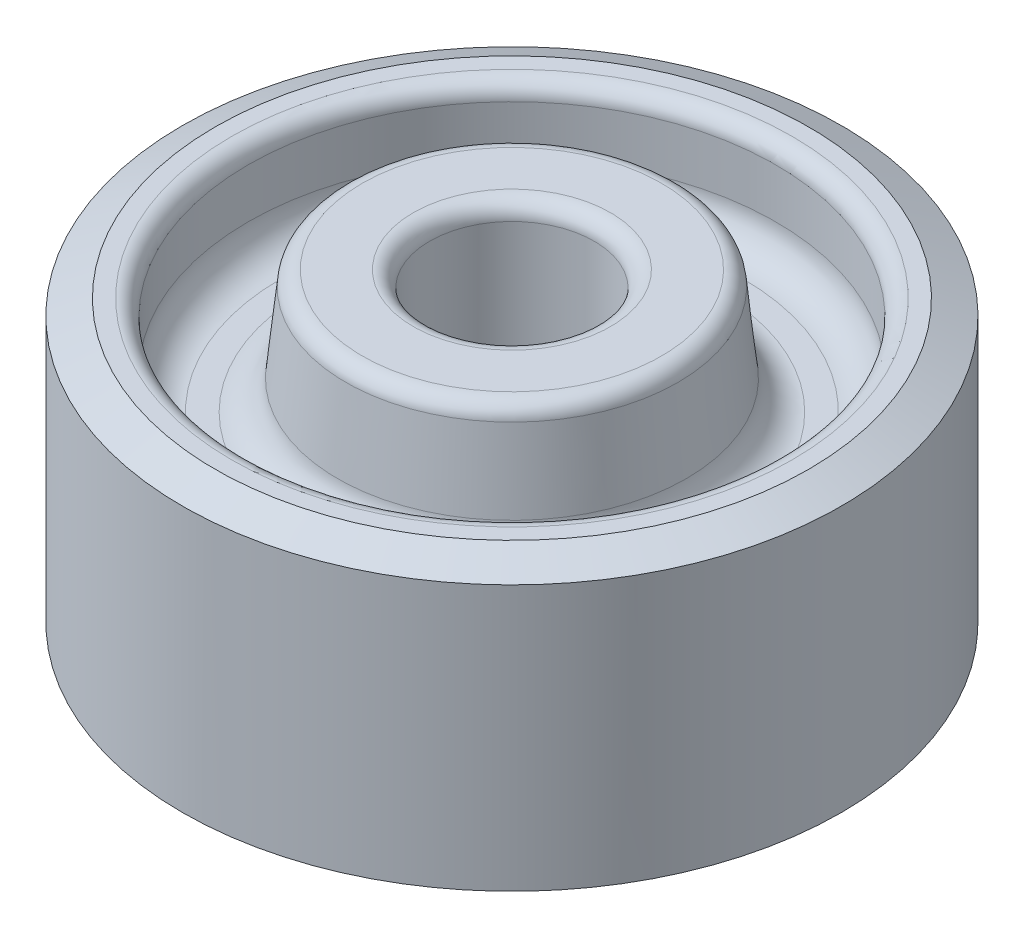
ISO-10303-21;
HEADER;
FILE_DESCRIPTION(('STEP AP214'),'2;1');
FILE_NAME('part.step','',(''),(''),'','','');
FILE_SCHEMA(('AUTOMOTIVE_DESIGN { 1 0 10303 214 1 1 1 1 }'));
ENDSEC;
DATA;
#1=APPLICATION_CONTEXT('core data for automotive mechanical design processes');
#2=APPLICATION_PROTOCOL_DEFINITION('international standard','automotive_design',2000,#1);
#3=PRODUCT_CONTEXT('',#1,'mechanical');
#4=PRODUCT('Part','Part','',(#3));
#5=PRODUCT_RELATED_PRODUCT_CATEGORY('part','',(#4));
#6=PRODUCT_DEFINITION_FORMATION('','',#4);
#7=PRODUCT_DEFINITION_CONTEXT('part definition',#1,'design');
#8=PRODUCT_DEFINITION('design','',#6,#7);
#9=PRODUCT_DEFINITION_SHAPE('','',#8);
#10=(LENGTH_UNIT() NAMED_UNIT(*) SI_UNIT(.MILLI.,.METRE.));
#11=(NAMED_UNIT(*) PLANE_ANGLE_UNIT() SI_UNIT($,.RADIAN.));
#12=(NAMED_UNIT(*) SI_UNIT($,.STERADIAN.) SOLID_ANGLE_UNIT());
#13=UNCERTAINTY_MEASURE_WITH_UNIT(LENGTH_MEASURE(1.E-05),#10,'distance_accuracy_value','');
#14=(GEOMETRIC_REPRESENTATION_CONTEXT(3) GLOBAL_UNCERTAINTY_ASSIGNED_CONTEXT((#13)) GLOBAL_UNIT_ASSIGNED_CONTEXT((#10,
#11,#12)) REPRESENTATION_CONTEXT('',''));
#15=CARTESIAN_POINT('',(0.,0.,0.));
#16=DIRECTION('',(0.,0.,1.));
#17=DIRECTION('',(1.,0.,0.));
#18=AXIS2_PLACEMENT_3D('',#15,#16,#17);
#19=CARTESIAN_POINT('',(0.,10.5,0.));
#20=DIRECTION('',(0.,1.,0.));
#21=DIRECTION('',(-1.,0.,0.));
#22=AXIS2_PLACEMENT_3D('',#19,#20,#21);
#23=CYLINDRICAL_SURFACE('',#22,5.);
#24=CARTESIAN_POINT('',(0.,9.5,0.));
#25=DIRECTION('',(0.,1.,0.));
#26=DIRECTION('',(-1.,0.,0.));
#27=AXIS2_PLACEMENT_3D('',#24,#25,#26);
#28=CIRCLE('',#27,5.);
#29=CARTESIAN_POINT('',(-5.,9.5,0.));
#30=VERTEX_POINT('',#29);
#31=EDGE_CURVE('E101',#30,#30,#28,.T.);
#32=ORIENTED_EDGE('',*,*,#31,.T.);
#33=EDGE_LOOP('',(#32));
#34=FACE_BOUND('',#33,.T.);
#35=CARTESIAN_POINT('',(0.,-9.5,0.));
#36=DIRECTION('',(0.,-1.,0.));
#37=DIRECTION('',(1.,0.,0.));
#38=AXIS2_PLACEMENT_3D('',#35,#36,#37);
#39=CIRCLE('',#38,5.);
#40=CARTESIAN_POINT('',(5.,-9.5,0.));
#41=VERTEX_POINT('',#40);
#42=EDGE_CURVE('E105',#41,#41,#39,.T.);
#43=ORIENTED_EDGE('',*,*,#42,.T.);
#44=EDGE_LOOP('',(#43));
#45=FACE_BOUND('',#44,.T.);
#46=ADVANCED_FACE('F37',(#34,#45),#23,.F.);
#47=CARTESIAN_POINT('',(-5.,-10.5,0.));
#48=DIRECTION('',(0.,-1.,0.));
#49=DIRECTION('',(1.,0.,0.));
#50=AXIS2_PLACEMENT_3D('',#47,#48,#49);
#51=PLANE('',#50);
#52=CARTESIAN_POINT('',(0.,-10.5,0.));
#53=DIRECTION('',(0.,-1.,0.));
#54=DIRECTION('',(1.,0.,0.));
#55=AXIS2_PLACEMENT_3D('',#52,#53,#54);
#56=CIRCLE('',#55,9.09959595570216);
#57=CARTESIAN_POINT('',(9.09959595570216,-10.5,0.));
#58=VERTEX_POINT('',#57);
#59=EDGE_CURVE('E77',#58,#58,#56,.T.);
#60=ORIENTED_EDGE('',*,*,#59,.T.);
#61=EDGE_LOOP('',(#60));
#62=FACE_BOUND('',#61,.T.);
#63=CARTESIAN_POINT('',(0.,-10.5,0.));
#64=DIRECTION('',(0.,-1.,0.));
#65=DIRECTION('',(1.,0.,0.));
#66=AXIS2_PLACEMENT_3D('',#63,#64,#65);
#67=CIRCLE('',#66,6.);
#68=CARTESIAN_POINT('',(6.,-10.5,0.));
#69=VERTEX_POINT('',#68);
#70=EDGE_CURVE('E81',#69,#69,#67,.F.);
#71=ORIENTED_EDGE('',*,*,#70,.T.);
#72=EDGE_LOOP('',(#71));
#73=FACE_BOUND('',#72,.T.);
#74=ADVANCED_FACE('F163',(#62,#73),#51,.T.);
#75=CARTESIAN_POINT('',(0.,-3.,0.));
#76=DIRECTION('',(0.,1.,0.));
#77=DIRECTION('',(-1.,0.,0.));
#78=AXIS2_PLACEMENT_3D('',#75,#76,#77);
#79=CONICAL_SURFACE('',#78,10.7882817644925,0.104719755119656);
#80=CARTESIAN_POINT('',(0.,-9.60452846326765,0.));
#81=DIRECTION('',(0.,-1.,0.));
#82=DIRECTION('',(1.,0.,0.));
#83=AXIS2_PLACEMENT_3D('',#80,#81,#82);
#84=CIRCLE('',#83,10.0941178510704);
#85=CARTESIAN_POINT('',(10.0941178510704,-9.60452846326764,0.));
#86=VERTEX_POINT('',#85);
#87=EDGE_CURVE('E85',#86,#86,#84,.F.);
#88=ORIENTED_EDGE('',*,*,#87,.T.);
#89=EDGE_LOOP('',(#88));
#90=FACE_BOUND('',#89,.T.);
#91=CARTESIAN_POINT('',(0.,-4.7909430734647,0.));
#92=DIRECTION('',(0.,1.,0.));
#93=DIRECTION('',(-1.,0.,0.));
#94=AXIS2_PLACEMENT_3D('',#91,#92,#93);
#95=CIRCLE('',#94,10.6000460623517);
#96=CARTESIAN_POINT('',(-10.6000460623517,-4.7909430734647,0.));
#97=VERTEX_POINT('',#96);
#98=EDGE_CURVE('E125',#97,#97,#95,.F.);
#99=ORIENTED_EDGE('',*,*,#98,.T.);
#100=EDGE_LOOP('',(#99));
#101=FACE_BOUND('',#100,.T.);
#102=ADVANCED_FACE('F168',(#90,#101),#79,.T.);
#103=CARTESIAN_POINT('',(-10.7882817644925,-3.,0.));
#104=DIRECTION('',(0.,-1.,0.));
#105=DIRECTION('',(1.,0.,0.));
#106=AXIS2_PLACEMENT_3D('',#103,#104,#105);
#107=PLANE('',#106);
#108=CARTESIAN_POINT('',(0.,-3.,0.));
#109=DIRECTION('',(0.,-1.,0.));
#110=DIRECTION('',(1.,0.,0.));
#111=AXIS2_PLACEMENT_3D('',#108,#109,#110);
#112=CIRCLE('',#111,14.0382817644925);
#113=CARTESIAN_POINT('',(14.0382817644925,-2.99999999999999,0.));
#114=VERTEX_POINT('',#113);
#115=EDGE_CURVE('E129',#114,#114,#112,.T.);
#116=ORIENTED_EDGE('',*,*,#115,.T.);
#117=EDGE_LOOP('',(#116));
#118=FACE_BOUND('',#117,.T.);
#119=CARTESIAN_POINT('',(0.,-3.,0.));
#120=DIRECTION('',(0.,-1.,0.));
#121=DIRECTION('',(1.,0.,0.));
#122=AXIS2_PLACEMENT_3D('',#119,#120,#121);
#123=CIRCLE('',#122,12.5890898530882);
#124=CARTESIAN_POINT('',(12.5890898530882,-2.99999999999999,0.));
#125=VERTEX_POINT('',#124);
#126=EDGE_CURVE('E133',#125,#125,#123,.F.);
#127=ORIENTED_EDGE('',*,*,#126,.T.);
#128=EDGE_LOOP('',(#127));
#129=FACE_BOUND('',#128,.T.);
#130=ADVANCED_FACE('F175',(#118,#129),#107,.T.);
#131=CARTESIAN_POINT('',(0.,10.5,0.));
#132=DIRECTION('',(0.,1.,0.));
#133=DIRECTION('',(-1.,0.,0.));
#134=AXIS2_PLACEMENT_3D('',#131,#132,#133);
#135=CYLINDRICAL_SURFACE('',#134,16.0382817644925);
#136=CARTESIAN_POINT('',(0.,-8.,0.));
#137=DIRECTION('',(0.,-1.,0.));
#138=DIRECTION('',(1.,0.,0.));
#139=AXIS2_PLACEMENT_3D('',#136,#137,#138);
#140=CIRCLE('',#139,16.0382817644925);
#141=CARTESIAN_POINT('',(16.0382817644925,-7.99999999999999,0.));
#142=VERTEX_POINT('',#141);
#143=EDGE_CURVE('E69',#142,#142,#140,.T.);
#144=ORIENTED_EDGE('',*,*,#143,.T.);
#145=EDGE_LOOP('',(#144));
#146=FACE_BOUND('',#145,.T.);
#147=CARTESIAN_POINT('',(0.,-5.,0.));
#148=DIRECTION('',(0.,-1.,0.));
#149=DIRECTION('',(1.,0.,0.));
#150=AXIS2_PLACEMENT_3D('',#147,#148,#149);
#151=CIRCLE('',#150,16.0382817644925);
#152=CARTESIAN_POINT('',(16.0382817644925,-4.99999999999999,0.));
#153=VERTEX_POINT('',#152);
#154=EDGE_CURVE('E137',#153,#153,#151,.F.);
#155=ORIENTED_EDGE('',*,*,#154,.T.);
#156=EDGE_LOOP('',(#155));
#157=FACE_BOUND('',#156,.T.);
#158=ADVANCED_FACE('F142',(#146,#157),#135,.F.);
#159=CARTESIAN_POINT('',(-16.0382817644925,-9.,0.));
#160=DIRECTION('',(0.,-1.,0.));
#161=DIRECTION('',(1.,0.,0.));
#162=AXIS2_PLACEMENT_3D('',#159,#160,#161);
#163=PLANE('',#162);
#164=CARTESIAN_POINT('',(0.,-8.99999999999999,0.));
#165=DIRECTION('',(0.,-1.,0.));
#166=DIRECTION('',(1.,0.,0.));
#167=AXIS2_PLACEMENT_3D('',#164,#165,#166);
#168=CIRCLE('',#167,18.0382817644925);
#169=CARTESIAN_POINT('',(18.0382817644925,-8.99999999999999,0.));
#170=VERTEX_POINT('',#169);
#171=EDGE_CURVE('E50',#170,#170,#168,.T.);
#172=ORIENTED_EDGE('',*,*,#171,.T.);
#173=EDGE_LOOP('',(#172));
#174=FACE_BOUND('',#173,.T.);
#175=CARTESIAN_POINT('',(0.,-8.99999999999999,0.));
#176=DIRECTION('',(0.,-1.,0.));
#177=DIRECTION('',(1.,0.,0.));
#178=AXIS2_PLACEMENT_3D('',#175,#176,#177);
#179=CIRCLE('',#178,17.0382817644925);
#180=CARTESIAN_POINT('',(17.0382817644926,-8.99999999999999,0.));
#181=VERTEX_POINT('',#180);
#182=EDGE_CURVE('E73',#181,#181,#179,.F.);
#183=ORIENTED_EDGE('',*,*,#182,.T.);
#184=EDGE_LOOP('',(#183));
#185=FACE_BOUND('',#184,.T.);
#186=ADVANCED_FACE('F182',(#174,#185),#163,.T.);
#187=CARTESIAN_POINT('',(0.,10.5,0.));
#188=DIRECTION('',(0.,1.,0.));
#189=DIRECTION('',(-1.,0.,0.));
#190=AXIS2_PLACEMENT_3D('',#187,#188,#189);
#191=CYLINDRICAL_SURFACE('',#190,20.0382817644926);
#192=CARTESIAN_POINT('',(0.,8.06738468369,0.));
#193=DIRECTION('',(0.,1.,0.));
#194=DIRECTION('',(-1.,0.,0.));
#195=AXIS2_PLACEMENT_3D('',#192,#193,#194);
#196=CIRCLE('',#195,20.0382817644926);
#197=CARTESIAN_POINT('',(-20.0382817644926,8.06738468369,0.));
#198=VERTEX_POINT('',#197);
#199=EDGE_CURVE('E10',#198,#198,#196,.F.);
#200=ORIENTED_EDGE('',*,*,#199,.T.);
#201=EDGE_LOOP('',(#200));
#202=FACE_BOUND('',#201,.T.);
#203=CARTESIAN_POINT('',(0.,-8.06738468369,0.));
#204=DIRECTION('',(0.,-1.,0.));
#205=DIRECTION('',(1.,0.,0.));
#206=AXIS2_PLACEMENT_3D('',#203,#204,#205);
#207=CIRCLE('',#206,20.0382817644926);
#208=CARTESIAN_POINT('',(20.0382817644926,-8.06738468368999,0.));
#209=VERTEX_POINT('',#208);
#210=EDGE_CURVE('E55',#209,#209,#207,.F.);
#211=ORIENTED_EDGE('',*,*,#210,.T.);
#212=EDGE_LOOP('',(#211));
#213=FACE_BOUND('',#212,.T.);
#214=ADVANCED_FACE('F186',(#202,#213),#191,.T.);
#215=CARTESIAN_POINT('',(-16.0382817644925,9.,0.));
#216=DIRECTION('',(0.,1.,0.));
#217=DIRECTION('',(-1.,0.,0.));
#218=AXIS2_PLACEMENT_3D('',#215,#216,#217);
#219=PLANE('',#218);
#220=CARTESIAN_POINT('',(0.,9.,0.));
#221=DIRECTION('',(0.,1.,0.));
#222=DIRECTION('',(-1.,0.,0.));
#223=AXIS2_PLACEMENT_3D('',#220,#221,#222);
#224=CIRCLE('',#223,18.0382817644925);
#225=CARTESIAN_POINT('',(-18.0382817644925,9.,0.));
#226=VERTEX_POINT('',#225);
#227=EDGE_CURVE('E45',#226,#226,#224,.T.);
#228=ORIENTED_EDGE('',*,*,#227,.T.);
#229=EDGE_LOOP('',(#228));
#230=FACE_BOUND('',#229,.T.);
#231=CARTESIAN_POINT('',(0.,9.,0.));
#232=DIRECTION('',(0.,1.,0.));
#233=DIRECTION('',(-1.,0.,0.));
#234=AXIS2_PLACEMENT_3D('',#231,#232,#233);
#235=CIRCLE('',#234,17.0382817644925);
#236=CARTESIAN_POINT('',(-17.0382817644926,9.,0.));
#237=VERTEX_POINT('',#236);
#238=EDGE_CURVE('E61',#237,#237,#235,.F.);
#239=ORIENTED_EDGE('',*,*,#238,.T.);
#240=EDGE_LOOP('',(#239));
#241=FACE_BOUND('',#240,.T.);
#242=ADVANCED_FACE('F190',(#230,#241),#219,.T.);
#243=CARTESIAN_POINT('',(0.,10.5,0.));
#244=DIRECTION('',(0.,1.,0.));
#245=DIRECTION('',(-1.,0.,0.));
#246=AXIS2_PLACEMENT_3D('',#243,#244,#245);
#247=CYLINDRICAL_SURFACE('',#246,16.0382817644925);
#248=CARTESIAN_POINT('',(0.,8.,0.));
#249=DIRECTION('',(0.,1.,0.));
#250=DIRECTION('',(-1.,0.,0.));
#251=AXIS2_PLACEMENT_3D('',#248,#249,#250);
#252=CIRCLE('',#251,16.0382817644925);
#253=CARTESIAN_POINT('',(-16.0382817644925,8.,0.));
#254=VERTEX_POINT('',#253);
#255=EDGE_CURVE('E65',#254,#254,#252,.T.);
#256=ORIENTED_EDGE('',*,*,#255,.T.);
#257=EDGE_LOOP('',(#256));
#258=FACE_BOUND('',#257,.T.);
#259=CARTESIAN_POINT('',(0.,5.,0.));
#260=DIRECTION('',(0.,1.,0.));
#261=DIRECTION('',(-1.,0.,0.));
#262=AXIS2_PLACEMENT_3D('',#259,#260,#261);
#263=CIRCLE('',#262,16.0382817644925);
#264=CARTESIAN_POINT('',(-16.0382817644925,5.,0.));
#265=VERTEX_POINT('',#264);
#266=EDGE_CURVE('E109',#265,#265,#263,.F.);
#267=ORIENTED_EDGE('',*,*,#266,.T.);
#268=EDGE_LOOP('',(#267));
#269=FACE_BOUND('',#268,.T.);
#270=ADVANCED_FACE('F193',(#258,#269),#247,.F.);
#271=CARTESIAN_POINT('',(-10.7882817644925,3.,0.));
#272=DIRECTION('',(0.,1.,0.));
#273=DIRECTION('',(-1.,0.,0.));
#274=AXIS2_PLACEMENT_3D('',#271,#272,#273);
#275=PLANE('',#274);
#276=CARTESIAN_POINT('',(0.,3.,0.));
#277=DIRECTION('',(0.,1.,0.));
#278=DIRECTION('',(-1.,0.,0.));
#279=AXIS2_PLACEMENT_3D('',#276,#277,#278);
#280=CIRCLE('',#279,12.5890898530882);
#281=CARTESIAN_POINT('',(-12.5890898530882,3.,0.));
#282=VERTEX_POINT('',#281);
#283=EDGE_CURVE('E113',#282,#282,#280,.F.);
#284=ORIENTED_EDGE('',*,*,#283,.T.);
#285=EDGE_LOOP('',(#284));
#286=FACE_BOUND('',#285,.T.);
#287=CARTESIAN_POINT('',(0.,3.,0.));
#288=DIRECTION('',(0.,1.,0.));
#289=DIRECTION('',(-1.,0.,0.));
#290=AXIS2_PLACEMENT_3D('',#287,#288,#289);
#291=CIRCLE('',#290,14.0382817644925);
#292=CARTESIAN_POINT('',(-14.0382817644925,3.,0.));
#293=VERTEX_POINT('',#292);
#294=EDGE_CURVE('E117',#293,#293,#291,.T.);
#295=ORIENTED_EDGE('',*,*,#294,.T.);
#296=EDGE_LOOP('',(#295));
#297=FACE_BOUND('',#296,.T.);
#298=ADVANCED_FACE('F196',(#286,#297),#275,.T.);
#299=CARTESIAN_POINT('',(0.,10.5,0.));
#300=DIRECTION('',(0.,-1.,0.));
#301=DIRECTION('',(1.,0.,0.));
#302=AXIS2_PLACEMENT_3D('',#299,#300,#301);
#303=CONICAL_SURFACE('',#302,10.,0.104719755119657);
#304=CARTESIAN_POINT('',(0.,9.60452846326766,0.));
#305=DIRECTION('',(0.,1.,0.));
#306=DIRECTION('',(-1.,0.,0.));
#307=AXIS2_PLACEMENT_3D('',#304,#305,#306);
#308=CIRCLE('',#307,10.0941178510704);
#309=CARTESIAN_POINT('',(-10.0941178510704,9.60452846326766,0.));
#310=VERTEX_POINT('',#309);
#311=EDGE_CURVE('E89',#310,#310,#308,.F.);
#312=ORIENTED_EDGE('',*,*,#311,.T.);
#313=EDGE_LOOP('',(#312));
#314=FACE_BOUND('',#313,.T.);
#315=CARTESIAN_POINT('',(0.,4.7909430734647,0.));
#316=DIRECTION('',(0.,-1.,0.));
#317=DIRECTION('',(1.,0.,0.));
#318=AXIS2_PLACEMENT_3D('',#315,#316,#317);
#319=CIRCLE('',#318,10.6000460623517);
#320=CARTESIAN_POINT('',(10.6000460623517,4.7909430734647,0.));
#321=VERTEX_POINT('',#320);
#322=EDGE_CURVE('E121',#321,#321,#319,.F.);
#323=ORIENTED_EDGE('',*,*,#322,.T.);
#324=EDGE_LOOP('',(#323));
#325=FACE_BOUND('',#324,.T.);
#326=ADVANCED_FACE('F157',(#314,#325),#303,.T.);
#327=CARTESIAN_POINT('',(-5.,10.5,0.));
#328=DIRECTION('',(0.,1.,0.));
#329=DIRECTION('',(-1.,0.,0.));
#330=AXIS2_PLACEMENT_3D('',#327,#328,#329);
#331=PLANE('',#330);
#332=CARTESIAN_POINT('',(0.,10.5,0.));
#333=DIRECTION('',(0.,1.,0.));
#334=DIRECTION('',(-1.,0.,0.));
#335=AXIS2_PLACEMENT_3D('',#332,#333,#334);
#336=CIRCLE('',#335,6.);
#337=CARTESIAN_POINT('',(-6.,10.5,0.));
#338=VERTEX_POINT('',#337);
#339=EDGE_CURVE('E93',#338,#338,#336,.F.);
#340=ORIENTED_EDGE('',*,*,#339,.T.);
#341=EDGE_LOOP('',(#340));
#342=FACE_BOUND('',#341,.T.);
#343=CARTESIAN_POINT('',(0.,10.5,0.));
#344=DIRECTION('',(0.,1.,0.));
#345=DIRECTION('',(-1.,0.,0.));
#346=AXIS2_PLACEMENT_3D('',#343,#344,#345);
#347=CIRCLE('',#346,9.09959595570215);
#348=CARTESIAN_POINT('',(-9.09959595570216,10.5,0.));
#349=VERTEX_POINT('',#348);
#350=EDGE_CURVE('E97',#349,#349,#347,.T.);
#351=ORIENTED_EDGE('',*,*,#350,.T.);
#352=EDGE_LOOP('',(#351));
#353=FACE_BOUND('',#352,.T.);
#354=ADVANCED_FACE('F147',(#342,#353),#331,.T.);
#355=CARTESIAN_POINT('',(0.,-5.,0.));
#356=DIRECTION('',(0.,-1.,0.));
#357=DIRECTION('',(1.,0.,0.));
#358=AXIS2_PLACEMENT_3D('',#355,#356,#357);
#359=TOROIDAL_SURFACE('',#358,14.0382817644925,2.);
#360=ORIENTED_EDGE('',*,*,#115,.F.);
#361=EDGE_LOOP('',(#360));
#362=FACE_BOUND('',#361,.T.);
#363=ORIENTED_EDGE('',*,*,#154,.F.);
#364=EDGE_LOOP('',(#363));
#365=FACE_BOUND('',#364,.T.);
#366=ADVANCED_FACE('F144',(#362,#365),#359,.F.);
#367=CARTESIAN_POINT('',(0.,-5.,0.));
#368=DIRECTION('',(0.,-1.,0.));
#369=DIRECTION('',(1.,0.,0.));
#370=AXIS2_PLACEMENT_3D('',#367,#368,#369);
#371=TOROIDAL_SURFACE('',#370,12.5890898530882,2.);
#372=ORIENTED_EDGE('',*,*,#98,.F.);
#373=EDGE_LOOP('',(#372));
#374=FACE_BOUND('',#373,.T.);
#375=ORIENTED_EDGE('',*,*,#126,.F.);
#376=EDGE_LOOP('',(#375));
#377=FACE_BOUND('',#376,.T.);
#378=ADVANCED_FACE('F146',(#374,#377),#371,.F.);
#379=CARTESIAN_POINT('',(0.,5.,0.));
#380=DIRECTION('',(0.,1.,0.));
#381=DIRECTION('',(-1.,0.,0.));
#382=AXIS2_PLACEMENT_3D('',#379,#380,#381);
#383=TOROIDAL_SURFACE('',#382,12.5890898530882,2.);
#384=ORIENTED_EDGE('',*,*,#283,.F.);
#385=EDGE_LOOP('',(#384));
#386=FACE_BOUND('',#385,.T.);
#387=ORIENTED_EDGE('',*,*,#322,.F.);
#388=EDGE_LOOP('',(#387));
#389=FACE_BOUND('',#388,.T.);
#390=ADVANCED_FACE('F154',(#386,#389),#383,.F.);
#391=CARTESIAN_POINT('',(0.,5.,0.));
#392=DIRECTION('',(0.,1.,0.));
#393=DIRECTION('',(-1.,0.,0.));
#394=AXIS2_PLACEMENT_3D('',#391,#392,#393);
#395=TOROIDAL_SURFACE('',#394,14.0382817644925,2.);
#396=ORIENTED_EDGE('',*,*,#266,.F.);
#397=EDGE_LOOP('',(#396));
#398=FACE_BOUND('',#397,.T.);
#399=ORIENTED_EDGE('',*,*,#294,.F.);
#400=EDGE_LOOP('',(#399));
#401=FACE_BOUND('',#400,.T.);
#402=ADVANCED_FACE('F210',(#398,#401),#395,.F.);
#403=CARTESIAN_POINT('',(0.,9.5,0.));
#404=DIRECTION('',(0.,1.,0.));
#405=DIRECTION('',(-1.,0.,0.));
#406=AXIS2_PLACEMENT_3D('',#403,#404,#405);
#407=TOROIDAL_SURFACE('',#406,6.,1.);
#408=ORIENTED_EDGE('',*,*,#339,.F.);
#409=EDGE_LOOP('',(#408));
#410=FACE_BOUND('',#409,.T.);
#411=ORIENTED_EDGE('',*,*,#31,.F.);
#412=EDGE_LOOP('',(#411));
#413=FACE_BOUND('',#412,.T.);
#414=ADVANCED_FACE('F216',(#410,#413),#407,.T.);
#415=CARTESIAN_POINT('',(0.,9.5,0.));
#416=DIRECTION('',(0.,1.,0.));
#417=DIRECTION('',(-1.,0.,0.));
#418=AXIS2_PLACEMENT_3D('',#415,#416,#417);
#419=TOROIDAL_SURFACE('',#418,9.09959595570215,1.);
#420=ORIENTED_EDGE('',*,*,#311,.F.);
#421=EDGE_LOOP('',(#420));
#422=FACE_BOUND('',#421,.T.);
#423=ORIENTED_EDGE('',*,*,#350,.F.);
#424=EDGE_LOOP('',(#423));
#425=FACE_BOUND('',#424,.T.);
#426=ADVANCED_FACE('F223',(#422,#425),#419,.T.);
#427=CARTESIAN_POINT('',(0.,-9.5,0.));
#428=DIRECTION('',(0.,-1.,0.));
#429=DIRECTION('',(1.,0.,0.));
#430=AXIS2_PLACEMENT_3D('',#427,#428,#429);
#431=TOROIDAL_SURFACE('',#430,9.09959595570216,1.);
#432=ORIENTED_EDGE('',*,*,#59,.F.);
#433=EDGE_LOOP('',(#432));
#434=FACE_BOUND('',#433,.T.);
#435=ORIENTED_EDGE('',*,*,#87,.F.);
#436=EDGE_LOOP('',(#435));
#437=FACE_BOUND('',#436,.T.);
#438=ADVANCED_FACE('F227',(#434,#437),#431,.T.);
#439=CARTESIAN_POINT('',(0.,-9.5,0.));
#440=DIRECTION('',(0.,-1.,0.));
#441=DIRECTION('',(1.,0.,0.));
#442=AXIS2_PLACEMENT_3D('',#439,#440,#441);
#443=TOROIDAL_SURFACE('',#442,6.,1.);
#444=ORIENTED_EDGE('',*,*,#42,.F.);
#445=EDGE_LOOP('',(#444));
#446=FACE_BOUND('',#445,.T.);
#447=ORIENTED_EDGE('',*,*,#70,.F.);
#448=EDGE_LOOP('',(#447));
#449=FACE_BOUND('',#448,.T.);
#450=ADVANCED_FACE('F231',(#446,#449),#443,.T.);
#451=CARTESIAN_POINT('',(0.,-8.,0.));
#452=DIRECTION('',(0.,-1.,0.));
#453=DIRECTION('',(1.,0.,0.));
#454=AXIS2_PLACEMENT_3D('',#451,#452,#453);
#455=TOROIDAL_SURFACE('',#454,17.0382817644925,1.);
#456=ORIENTED_EDGE('',*,*,#143,.F.);
#457=EDGE_LOOP('',(#456));
#458=FACE_BOUND('',#457,.T.);
#459=ORIENTED_EDGE('',*,*,#182,.F.);
#460=EDGE_LOOP('',(#459));
#461=FACE_BOUND('',#460,.T.);
#462=ADVANCED_FACE('F235',(#458,#461),#455,.T.);
#463=CARTESIAN_POINT('',(0.,8.,0.));
#464=DIRECTION('',(0.,1.,0.));
#465=DIRECTION('',(-1.,0.,0.));
#466=AXIS2_PLACEMENT_3D('',#463,#464,#465);
#467=TOROIDAL_SURFACE('',#466,17.0382817644925,1.);
#468=ORIENTED_EDGE('',*,*,#238,.F.);
#469=EDGE_LOOP('',(#468));
#470=FACE_BOUND('',#469,.T.);
#471=ORIENTED_EDGE('',*,*,#255,.F.);
#472=EDGE_LOOP('',(#471));
#473=FACE_BOUND('',#472,.T.);
#474=ADVANCED_FACE('F239',(#470,#473),#467,.T.);
#475=CARTESIAN_POINT('',(0.,-8.06738468369,0.));
#476=DIRECTION('',(0.,1.,0.));
#477=DIRECTION('',(-1.,0.,0.));
#478=AXIS2_PLACEMENT_3D('',#475,#476,#477);
#479=CONICAL_SURFACE('',#478,20.0382817644926,1.13446401379632);
#480=ORIENTED_EDGE('',*,*,#171,.F.);
#481=EDGE_LOOP('',(#480));
#482=FACE_BOUND('',#481,.T.);
#483=ORIENTED_EDGE('',*,*,#210,.F.);
#484=EDGE_LOOP('',(#483));
#485=FACE_BOUND('',#484,.T.);
#486=ADVANCED_FACE('F242',(#482,#485),#479,.T.);
#487=CARTESIAN_POINT('',(0.,9.,0.));
#488=DIRECTION('',(0.,-1.,0.));
#489=DIRECTION('',(1.,0.,0.));
#490=AXIS2_PLACEMENT_3D('',#487,#488,#489);
#491=CONICAL_SURFACE('',#490,18.0382817644925,1.13446401379632);
#492=ORIENTED_EDGE('',*,*,#199,.F.);
#493=EDGE_LOOP('',(#492));
#494=FACE_BOUND('',#493,.T.);
#495=ORIENTED_EDGE('',*,*,#227,.F.);
#496=EDGE_LOOP('',(#495));
#497=FACE_BOUND('',#496,.T.);
#498=ADVANCED_FACE('F39',(#494,#497),#491,.T.);
#499=CLOSED_SHELL('',(#46,#74,#102,#130,#158,#186,#214,#242,#270,#298,#326,#354,#366,#378,#390,
#402,#414,#426,#438,#450,#462,#474,#486,#498));
#500=MANIFOLD_SOLID_BREP('B2',#499);
#501=ADVANCED_BREP_SHAPE_REPRESENTATION('',(#18,#500),#14);
#502=SHAPE_DEFINITION_REPRESENTATION(#9,#501);
ENDSEC;
END-ISO-10303-21;
